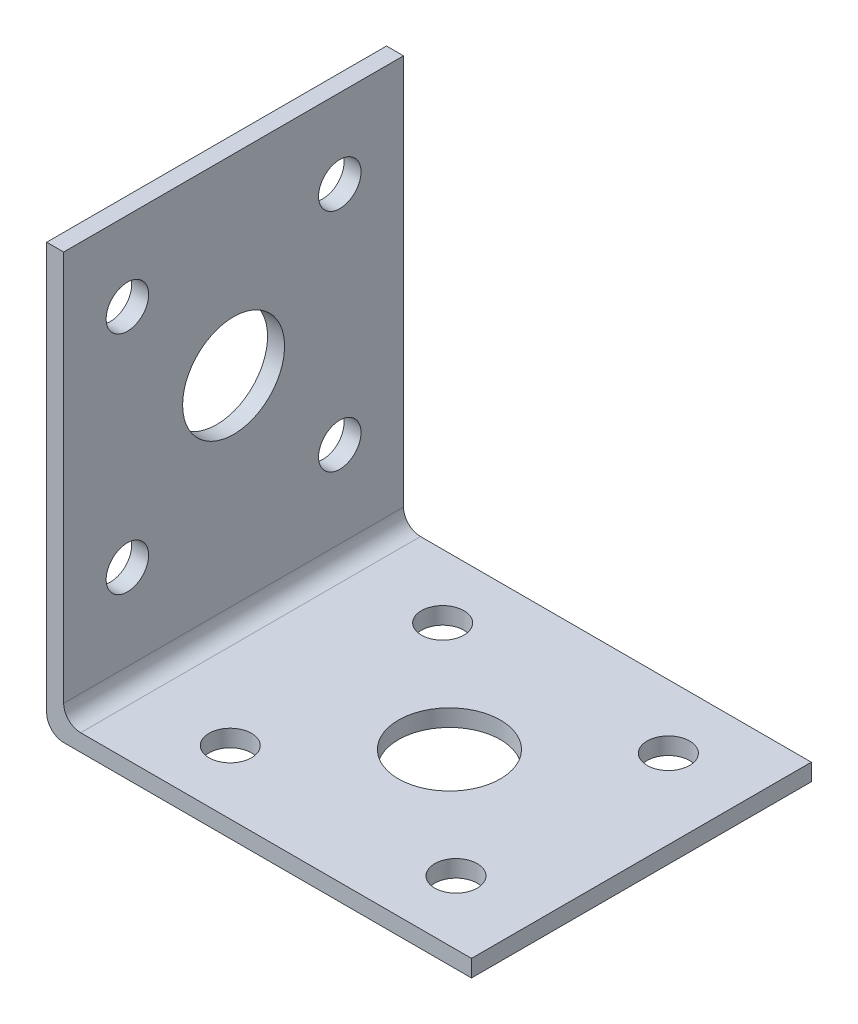
ISO-10303-21;
HEADER;
FILE_DESCRIPTION(('STEP AP214'),'2;1');
FILE_NAME('part.step','',(''),(''),'','','');
FILE_SCHEMA(('AUTOMOTIVE_DESIGN { 1 0 10303 214 1 1 1 1 }'));
ENDSEC;
DATA;
#1=APPLICATION_CONTEXT('core data for automotive mechanical design processes');
#2=APPLICATION_PROTOCOL_DEFINITION('international standard','automotive_design',2000,#1);
#3=PRODUCT_CONTEXT('',#1,'mechanical');
#4=PRODUCT('Part','Part','',(#3));
#5=PRODUCT_RELATED_PRODUCT_CATEGORY('part','',(#4));
#6=PRODUCT_DEFINITION_FORMATION('','',#4);
#7=PRODUCT_DEFINITION_CONTEXT('part definition',#1,'design');
#8=PRODUCT_DEFINITION('design','',#6,#7);
#9=PRODUCT_DEFINITION_SHAPE('','',#8);
#10=(LENGTH_UNIT() NAMED_UNIT(*) SI_UNIT(.MILLI.,.METRE.));
#11=(NAMED_UNIT(*) PLANE_ANGLE_UNIT() SI_UNIT($,.RADIAN.));
#12=(NAMED_UNIT(*) SI_UNIT($,.STERADIAN.) SOLID_ANGLE_UNIT());
#13=UNCERTAINTY_MEASURE_WITH_UNIT(LENGTH_MEASURE(1.E-05),#10,'distance_accuracy_value','');
#14=(GEOMETRIC_REPRESENTATION_CONTEXT(3) GLOBAL_UNCERTAINTY_ASSIGNED_CONTEXT((#13)) GLOBAL_UNIT_ASSIGNED_CONTEXT((#10,
#11,#12)) REPRESENTATION_CONTEXT('',''));
#15=CARTESIAN_POINT('',(0.,0.,0.));
#16=DIRECTION('',(0.,0.,1.));
#17=DIRECTION('',(1.,0.,0.));
#18=AXIS2_PLACEMENT_3D('',#15,#16,#17);
#19=CARTESIAN_POINT('',(0.,50.,20.));
#20=DIRECTION('',(0.,-1.,0.));
#21=DIRECTION('',(0.,0.,-1.));
#22=AXIS2_PLACEMENT_3D('',#19,#20,#21);
#23=PLANE('',#22);
#24=DIRECTION('',(-1.,0.,0.));
#25=VECTOR('',#24,1.);
#26=CARTESIAN_POINT('',(0.,50.,-20.));
#27=LINE('',#26,#25);
#28=CARTESIAN_POINT('',(2.,50.,-20.));
#29=VERTEX_POINT('',#28);
#30=CARTESIAN_POINT('',(0.,50.,-20.));
#31=VERTEX_POINT('',#30);
#32=EDGE_CURVE('E133',#29,#31,#27,.T.);
#33=ORIENTED_EDGE('',*,*,#32,.T.);
#34=DIRECTION('',(0.,0.,-1.));
#35=VECTOR('',#34,1.);
#36=CARTESIAN_POINT('',(0.,50.,20.));
#37=LINE('',#36,#35);
#38=CARTESIAN_POINT('',(0.,50.,20.));
#39=VERTEX_POINT('',#38);
#40=EDGE_CURVE('E11',#39,#31,#37,.T.);
#41=ORIENTED_EDGE('',*,*,#40,.F.);
#42=DIRECTION('',(-1.,0.,0.));
#43=VECTOR('',#42,1.);
#44=CARTESIAN_POINT('',(0.,50.,20.));
#45=LINE('',#44,#43);
#46=CARTESIAN_POINT('',(2.,50.,20.));
#47=VERTEX_POINT('',#46);
#48=EDGE_CURVE('E148',#47,#39,#45,.T.);
#49=ORIENTED_EDGE('',*,*,#48,.F.);
#50=DIRECTION('',(0.,0.,-1.));
#51=VECTOR('',#50,1.);
#52=CARTESIAN_POINT('',(2.,50.,20.));
#53=LINE('',#52,#51);
#54=EDGE_CURVE('E129',#47,#29,#53,.T.);
#55=ORIENTED_EDGE('',*,*,#54,.T.);
#56=EDGE_LOOP('',(#33,#41,#49,#55));
#57=FACE_BOUND('',#56,.T.);
#58=ADVANCED_FACE('F37',(#57),#23,.F.);
#59=CARTESIAN_POINT('',(0.,2.00000000000001,20.));
#60=DIRECTION('',(1.,0.,0.));
#61=DIRECTION('',(0.,0.,-1.));
#62=AXIS2_PLACEMENT_3D('',#59,#60,#61);
#63=PLANE('',#62);
#64=CARTESIAN_POINT('',(0.,14.1076439807601,-12.5));
#65=DIRECTION('',(1.,0.,0.));
#66=DIRECTION('',(0.,0.,-1.));
#67=AXIS2_PLACEMENT_3D('',#64,#65,#66);
#68=CIRCLE('',#67,2.5);
#69=CARTESIAN_POINT('',(0.,14.1076439807601,-15.));
#70=VERTEX_POINT('',#69);
#71=EDGE_CURVE('E203',#70,#70,#68,.F.);
#72=ORIENTED_EDGE('',*,*,#71,.F.);
#73=EDGE_LOOP('',(#72));
#74=FACE_BOUND('',#73,.T.);
#75=CARTESIAN_POINT('',(0.,14.1076439807601,12.5));
#76=DIRECTION('',(1.,0.,0.));
#77=DIRECTION('',(0.,0.,-1.));
#78=AXIS2_PLACEMENT_3D('',#75,#76,#77);
#79=CIRCLE('',#78,2.5);
#80=CARTESIAN_POINT('',(0.,14.1076439807601,10.));
#81=VERTEX_POINT('',#80);
#82=EDGE_CURVE('E213',#81,#81,#79,.F.);
#83=ORIENTED_EDGE('',*,*,#82,.F.);
#84=EDGE_LOOP('',(#83));
#85=FACE_BOUND('',#84,.T.);
#86=CARTESIAN_POINT('',(0.,40.6750781181339,12.5));
#87=DIRECTION('',(1.,0.,0.));
#88=DIRECTION('',(0.,0.,-1.));
#89=AXIS2_PLACEMENT_3D('',#86,#87,#88);
#90=CIRCLE('',#89,2.5);
#91=CARTESIAN_POINT('',(0.,40.6750781181339,10.));
#92=VERTEX_POINT('',#91);
#93=EDGE_CURVE('E216',#92,#92,#90,.F.);
#94=ORIENTED_EDGE('',*,*,#93,.F.);
#95=EDGE_LOOP('',(#94));
#96=FACE_BOUND('',#95,.T.);
#97=CARTESIAN_POINT('',(0.,40.6750781181339,-12.5));
#98=DIRECTION('',(1.,0.,0.));
#99=DIRECTION('',(0.,0.,-1.));
#100=AXIS2_PLACEMENT_3D('',#97,#98,#99);
#101=CIRCLE('',#100,2.5);
#102=CARTESIAN_POINT('',(0.,40.6750781181339,-15.));
#103=VERTEX_POINT('',#102);
#104=EDGE_CURVE('E219',#103,#103,#101,.F.);
#105=ORIENTED_EDGE('',*,*,#104,.F.);
#106=EDGE_LOOP('',(#105));
#107=FACE_BOUND('',#106,.T.);
#108=CARTESIAN_POINT('',(0.,27.405417892906,0.));
#109=DIRECTION('',(1.,0.,0.));
#110=DIRECTION('',(0.,0.,-1.));
#111=AXIS2_PLACEMENT_3D('',#108,#109,#110);
#112=CIRCLE('',#111,5.99999999999999);
#113=CARTESIAN_POINT('',(0.,27.405417892906,-5.99999999999999));
#114=VERTEX_POINT('',#113);
#115=EDGE_CURVE('E222',#114,#114,#112,.F.);
#116=ORIENTED_EDGE('',*,*,#115,.F.);
#117=EDGE_LOOP('',(#116));
#118=FACE_BOUND('',#117,.T.);
#119=DIRECTION('',(0.,-1.,0.));
#120=VECTOR('',#119,1.);
#121=CARTESIAN_POINT('',(0.,2.00000000000001,-20.));
#122=LINE('',#121,#120);
#123=CARTESIAN_POINT('',(0.,2.00000000000001,-20.));
#124=VERTEX_POINT('',#123);
#125=EDGE_CURVE('E136',#31,#124,#122,.T.);
#126=ORIENTED_EDGE('',*,*,#125,.T.);
#127=DIRECTION('',(0.,0.,-1.));
#128=VECTOR('',#127,1.);
#129=CARTESIAN_POINT('',(0.,2.00000000000001,20.));
#130=LINE('',#129,#128);
#131=CARTESIAN_POINT('',(0.,2.00000000000001,20.));
#132=VERTEX_POINT('',#131);
#133=EDGE_CURVE('E45',#132,#124,#130,.T.);
#134=ORIENTED_EDGE('',*,*,#133,.F.);
#135=DIRECTION('',(0.,-1.,0.));
#136=VECTOR('',#135,1.);
#137=CARTESIAN_POINT('',(0.,2.00000000000001,20.));
#138=LINE('',#137,#136);
#139=EDGE_CURVE('E96',#39,#132,#138,.T.);
#140=ORIENTED_EDGE('',*,*,#139,.F.);
#141=ORIENTED_EDGE('',*,*,#40,.T.);
#142=EDGE_LOOP('',(#126,#134,#140,#141));
#143=FACE_BOUND('',#142,.T.);
#144=ADVANCED_FACE('F252',(#74,#85,#96,#107,#118,#143),#63,.F.);
#145=CARTESIAN_POINT('',(2.,2.,20.));
#146=DIRECTION('',(0.,0.,-1.));
#147=DIRECTION('',(-1.,0.,0.));
#148=AXIS2_PLACEMENT_3D('',#145,#146,#147);
#149=CYLINDRICAL_SURFACE('',#148,2.);
#150=CARTESIAN_POINT('',(2.,2.,-20.));
#151=DIRECTION('',(0.,0.,1.));
#152=DIRECTION('',(1.,0.,0.));
#153=AXIS2_PLACEMENT_3D('',#150,#151,#152);
#154=CIRCLE('',#153,2.);
#155=CARTESIAN_POINT('',(2.00000000000001,0.,-20.));
#156=VERTEX_POINT('',#155);
#157=EDGE_CURVE('E139',#124,#156,#154,.T.);
#158=ORIENTED_EDGE('',*,*,#157,.T.);
#159=DIRECTION('',(0.,0.,-1.));
#160=VECTOR('',#159,1.);
#161=CARTESIAN_POINT('',(2.00000000000001,0.,20.));
#162=LINE('',#161,#160);
#163=CARTESIAN_POINT('',(2.00000000000001,0.,20.));
#164=VERTEX_POINT('',#163);
#165=EDGE_CURVE('E155',#164,#156,#162,.T.);
#166=ORIENTED_EDGE('',*,*,#165,.F.);
#167=CARTESIAN_POINT('',(2.,2.,20.));
#168=DIRECTION('',(0.,0.,1.));
#169=DIRECTION('',(1.,0.,0.));
#170=AXIS2_PLACEMENT_3D('',#167,#168,#169);
#171=CIRCLE('',#170,2.);
#172=EDGE_CURVE('E163',#132,#164,#171,.T.);
#173=ORIENTED_EDGE('',*,*,#172,.F.);
#174=ORIENTED_EDGE('',*,*,#133,.T.);
#175=EDGE_LOOP('',(#158,#166,#173,#174));
#176=FACE_BOUND('',#175,.T.);
#177=ADVANCED_FACE('F161',(#176),#149,.T.);
#178=CARTESIAN_POINT('',(50.,0.,20.));
#179=DIRECTION('',(0.,1.,0.));
#180=DIRECTION('',(0.,0.,1.));
#181=AXIS2_PLACEMENT_3D('',#178,#179,#180);
#182=PLANE('',#181);
#183=CARTESIAN_POINT('',(14.1076439807601,0.,-12.5));
#184=DIRECTION('',(0.,1.,0.));
#185=DIRECTION('',(0.,0.,1.));
#186=AXIS2_PLACEMENT_3D('',#183,#184,#185);
#187=CIRCLE('',#186,2.5);
#188=CARTESIAN_POINT('',(14.1076439807601,0.,-10.));
#189=VERTEX_POINT('',#188);
#190=EDGE_CURVE('E137',#189,#189,#187,.T.);
#191=ORIENTED_EDGE('',*,*,#190,.T.);
#192=EDGE_LOOP('',(#191));
#193=FACE_BOUND('',#192,.T.);
#194=CARTESIAN_POINT('',(14.1076439807601,0.,12.5));
#195=DIRECTION('',(0.,1.,0.));
#196=DIRECTION('',(0.,0.,1.));
#197=AXIS2_PLACEMENT_3D('',#194,#195,#196);
#198=CIRCLE('',#197,2.5);
#199=CARTESIAN_POINT('',(14.1076439807601,0.,15.));
#200=VERTEX_POINT('',#199);
#201=EDGE_CURVE('E183',#200,#200,#198,.T.);
#202=ORIENTED_EDGE('',*,*,#201,.T.);
#203=EDGE_LOOP('',(#202));
#204=FACE_BOUND('',#203,.T.);
#205=CARTESIAN_POINT('',(40.6750781181339,0.,12.5));
#206=DIRECTION('',(0.,1.,0.));
#207=DIRECTION('',(0.,0.,1.));
#208=AXIS2_PLACEMENT_3D('',#205,#206,#207);
#209=CIRCLE('',#208,2.5);
#210=CARTESIAN_POINT('',(40.6750781181339,0.,15.));
#211=VERTEX_POINT('',#210);
#212=EDGE_CURVE('E186',#211,#211,#209,.T.);
#213=ORIENTED_EDGE('',*,*,#212,.T.);
#214=EDGE_LOOP('',(#213));
#215=FACE_BOUND('',#214,.T.);
#216=CARTESIAN_POINT('',(40.6750781181339,0.,-12.5));
#217=DIRECTION('',(0.,1.,0.));
#218=DIRECTION('',(0.,0.,1.));
#219=AXIS2_PLACEMENT_3D('',#216,#217,#218);
#220=CIRCLE('',#219,2.5);
#221=CARTESIAN_POINT('',(40.6750781181339,0.,-10.));
#222=VERTEX_POINT('',#221);
#223=EDGE_CURVE('E189',#222,#222,#220,.T.);
#224=ORIENTED_EDGE('',*,*,#223,.T.);
#225=EDGE_LOOP('',(#224));
#226=FACE_BOUND('',#225,.T.);
#227=CARTESIAN_POINT('',(27.405417892906,0.,0.));
#228=DIRECTION('',(0.,1.,0.));
#229=DIRECTION('',(0.,0.,1.));
#230=AXIS2_PLACEMENT_3D('',#227,#228,#229);
#231=CIRCLE('',#230,5.99999999999999);
#232=CARTESIAN_POINT('',(27.405417892906,0.,6.));
#233=VERTEX_POINT('',#232);
#234=EDGE_CURVE('E192',#233,#233,#231,.T.);
#235=ORIENTED_EDGE('',*,*,#234,.T.);
#236=EDGE_LOOP('',(#235));
#237=FACE_BOUND('',#236,.T.);
#238=DIRECTION('',(1.,0.,0.));
#239=VECTOR('',#238,1.);
#240=CARTESIAN_POINT('',(50.,0.,-20.));
#241=LINE('',#240,#239);
#242=CARTESIAN_POINT('',(50.,0.,-20.));
#243=VERTEX_POINT('',#242);
#244=EDGE_CURVE('E141',#156,#243,#241,.T.);
#245=ORIENTED_EDGE('',*,*,#244,.T.);
#246=DIRECTION('',(0.,0.,-1.));
#247=VECTOR('',#246,1.);
#248=CARTESIAN_POINT('',(50.,0.,20.));
#249=LINE('',#248,#247);
#250=CARTESIAN_POINT('',(50.,0.,20.));
#251=VERTEX_POINT('',#250);
#252=EDGE_CURVE('E152',#251,#243,#249,.T.);
#253=ORIENTED_EDGE('',*,*,#252,.F.);
#254=DIRECTION('',(1.,0.,0.));
#255=VECTOR('',#254,1.);
#256=CARTESIAN_POINT('',(50.,0.,20.));
#257=LINE('',#256,#255);
#258=EDGE_CURVE('E175',#164,#251,#257,.T.);
#259=ORIENTED_EDGE('',*,*,#258,.F.);
#260=ORIENTED_EDGE('',*,*,#165,.T.);
#261=EDGE_LOOP('',(#245,#253,#259,#260));
#262=FACE_BOUND('',#261,.T.);
#263=ADVANCED_FACE('F171',(#193,#204,#215,#226,#237,#262),#182,.F.);
#264=CARTESIAN_POINT('',(50.,2.,20.));
#265=DIRECTION('',(-1.,0.,0.));
#266=DIRECTION('',(0.,0.,1.));
#267=AXIS2_PLACEMENT_3D('',#264,#265,#266);
#268=PLANE('',#267);
#269=DIRECTION('',(0.,1.,0.));
#270=VECTOR('',#269,1.);
#271=CARTESIAN_POINT('',(50.,2.,-20.));
#272=LINE('',#271,#270);
#273=CARTESIAN_POINT('',(50.,2.,-20.));
#274=VERTEX_POINT('',#273);
#275=EDGE_CURVE('E143',#243,#274,#272,.T.);
#276=ORIENTED_EDGE('',*,*,#275,.T.);
#277=DIRECTION('',(0.,0.,-1.));
#278=VECTOR('',#277,1.);
#279=CARTESIAN_POINT('',(50.,2.,20.));
#280=LINE('',#279,#278);
#281=CARTESIAN_POINT('',(50.,2.,20.));
#282=VERTEX_POINT('',#281);
#283=EDGE_CURVE('E124',#282,#274,#280,.T.);
#284=ORIENTED_EDGE('',*,*,#283,.F.);
#285=DIRECTION('',(0.,1.,0.));
#286=VECTOR('',#285,1.);
#287=CARTESIAN_POINT('',(50.,2.,20.));
#288=LINE('',#287,#286);
#289=EDGE_CURVE('E115',#251,#282,#288,.T.);
#290=ORIENTED_EDGE('',*,*,#289,.F.);
#291=ORIENTED_EDGE('',*,*,#252,.T.);
#292=EDGE_LOOP('',(#276,#284,#290,#291));
#293=FACE_BOUND('',#292,.T.);
#294=ADVANCED_FACE('F174',(#293),#268,.F.);
#295=CARTESIAN_POINT('',(4.00000000000002,2.,20.));
#296=DIRECTION('',(0.,-1.,0.));
#297=DIRECTION('',(0.,0.,-1.));
#298=AXIS2_PLACEMENT_3D('',#295,#296,#297);
#299=PLANE('',#298);
#300=CARTESIAN_POINT('',(14.1076439807601,2.,-12.5));
#301=DIRECTION('',(0.,1.,0.));
#302=DIRECTION('',(0.,0.,1.));
#303=AXIS2_PLACEMENT_3D('',#300,#301,#302);
#304=CIRCLE('',#303,2.5);
#305=CARTESIAN_POINT('',(14.1076439807601,2.,-10.));
#306=VERTEX_POINT('',#305);
#307=EDGE_CURVE('E199',#306,#306,#304,.T.);
#308=ORIENTED_EDGE('',*,*,#307,.F.);
#309=EDGE_LOOP('',(#308));
#310=FACE_BOUND('',#309,.T.);
#311=CARTESIAN_POINT('',(14.1076439807601,2.,12.5));
#312=DIRECTION('',(0.,1.,0.));
#313=DIRECTION('',(0.,0.,1.));
#314=AXIS2_PLACEMENT_3D('',#311,#312,#313);
#315=CIRCLE('',#314,2.5);
#316=CARTESIAN_POINT('',(14.1076439807601,2.,15.));
#317=VERTEX_POINT('',#316);
#318=EDGE_CURVE('E202',#317,#317,#315,.T.);
#319=ORIENTED_EDGE('',*,*,#318,.F.);
#320=EDGE_LOOP('',(#319));
#321=FACE_BOUND('',#320,.T.);
#322=CARTESIAN_POINT('',(40.6750781181339,2.,12.5));
#323=DIRECTION('',(0.,1.,0.));
#324=DIRECTION('',(0.,0.,1.));
#325=AXIS2_PLACEMENT_3D('',#322,#323,#324);
#326=CIRCLE('',#325,2.5);
#327=CARTESIAN_POINT('',(40.6750781181339,2.,15.));
#328=VERTEX_POINT('',#327);
#329=EDGE_CURVE('E206',#328,#328,#326,.T.);
#330=ORIENTED_EDGE('',*,*,#329,.F.);
#331=EDGE_LOOP('',(#330));
#332=FACE_BOUND('',#331,.T.);
#333=CARTESIAN_POINT('',(40.6750781181339,2.,-12.5));
#334=DIRECTION('',(0.,1.,0.));
#335=DIRECTION('',(0.,0.,1.));
#336=AXIS2_PLACEMENT_3D('',#333,#334,#335);
#337=CIRCLE('',#336,2.5);
#338=CARTESIAN_POINT('',(40.6750781181339,2.,-10.));
#339=VERTEX_POINT('',#338);
#340=EDGE_CURVE('E198',#339,#339,#337,.T.);
#341=ORIENTED_EDGE('',*,*,#340,.F.);
#342=EDGE_LOOP('',(#341));
#343=FACE_BOUND('',#342,.T.);
#344=CARTESIAN_POINT('',(27.405417892906,2.,0.));
#345=DIRECTION('',(0.,1.,0.));
#346=DIRECTION('',(0.,0.,1.));
#347=AXIS2_PLACEMENT_3D('',#344,#345,#346);
#348=CIRCLE('',#347,5.99999999999999);
#349=CARTESIAN_POINT('',(27.405417892906,2.,6.));
#350=VERTEX_POINT('',#349);
#351=EDGE_CURVE('E195',#350,#350,#348,.T.);
#352=ORIENTED_EDGE('',*,*,#351,.F.);
#353=EDGE_LOOP('',(#352));
#354=FACE_BOUND('',#353,.T.);
#355=DIRECTION('',(-1.,0.,0.));
#356=VECTOR('',#355,1.);
#357=CARTESIAN_POINT('',(4.00000000000002,2.,-20.));
#358=LINE('',#357,#356);
#359=CARTESIAN_POINT('',(4.00000000000002,2.,-20.));
#360=VERTEX_POINT('',#359);
#361=EDGE_CURVE('E123',#274,#360,#358,.T.);
#362=ORIENTED_EDGE('',*,*,#361,.T.);
#363=DIRECTION('',(0.,0.,-1.));
#364=VECTOR('',#363,1.);
#365=CARTESIAN_POINT('',(4.00000000000002,2.,20.));
#366=LINE('',#365,#364);
#367=CARTESIAN_POINT('',(4.00000000000002,2.,20.));
#368=VERTEX_POINT('',#367);
#369=EDGE_CURVE('E120',#368,#360,#366,.T.);
#370=ORIENTED_EDGE('',*,*,#369,.F.);
#371=DIRECTION('',(-1.,0.,0.));
#372=VECTOR('',#371,1.);
#373=CARTESIAN_POINT('',(4.00000000000002,2.,20.));
#374=LINE('',#373,#372);
#375=EDGE_CURVE('E109',#282,#368,#374,.T.);
#376=ORIENTED_EDGE('',*,*,#375,.F.);
#377=ORIENTED_EDGE('',*,*,#283,.T.);
#378=EDGE_LOOP('',(#362,#370,#376,#377));
#379=FACE_BOUND('',#378,.T.);
#380=ADVANCED_FACE('F121',(#310,#321,#332,#343,#354,#379),#299,.F.);
#381=CARTESIAN_POINT('',(4.00000000000001,4.,20.));
#382=DIRECTION('',(0.,0.,-1.));
#383=DIRECTION('',(-1.,0.,0.));
#384=AXIS2_PLACEMENT_3D('',#381,#382,#383);
#385=CYLINDRICAL_SURFACE('',#384,2.);
#386=CARTESIAN_POINT('',(4.00000000000001,4.,-20.));
#387=DIRECTION('',(0.,0.,-1.));
#388=DIRECTION('',(1.,0.,0.));
#389=AXIS2_PLACEMENT_3D('',#386,#387,#388);
#390=CIRCLE('',#389,2.);
#391=CARTESIAN_POINT('',(2.00000000000001,4.00000000000001,-20.));
#392=VERTEX_POINT('',#391);
#393=EDGE_CURVE('E82',#360,#392,#390,.T.);
#394=ORIENTED_EDGE('',*,*,#393,.T.);
#395=DIRECTION('',(0.,0.,-1.));
#396=VECTOR('',#395,1.);
#397=CARTESIAN_POINT('',(2.00000000000001,4.00000000000001,20.));
#398=LINE('',#397,#396);
#399=CARTESIAN_POINT('',(2.00000000000001,4.00000000000001,20.));
#400=VERTEX_POINT('',#399);
#401=EDGE_CURVE('E125',#400,#392,#398,.T.);
#402=ORIENTED_EDGE('',*,*,#401,.F.);
#403=CARTESIAN_POINT('',(4.00000000000001,4.,20.));
#404=DIRECTION('',(0.,0.,-1.));
#405=DIRECTION('',(1.,0.,0.));
#406=AXIS2_PLACEMENT_3D('',#403,#404,#405);
#407=CIRCLE('',#406,2.);
#408=EDGE_CURVE('E113',#368,#400,#407,.T.);
#409=ORIENTED_EDGE('',*,*,#408,.F.);
#410=ORIENTED_EDGE('',*,*,#369,.T.);
#411=EDGE_LOOP('',(#394,#402,#409,#410));
#412=FACE_BOUND('',#411,.T.);
#413=ADVANCED_FACE('F127',(#412),#385,.F.);
#414=CARTESIAN_POINT('',(2.,50.,20.));
#415=DIRECTION('',(-1.,0.,0.));
#416=DIRECTION('',(0.,-1.,0.));
#417=AXIS2_PLACEMENT_3D('',#414,#415,#416);
#418=PLANE('',#417);
#419=CARTESIAN_POINT('',(1.99999999999995,14.1076439807601,-12.5));
#420=DIRECTION('',(-1.,0.,0.));
#421=DIRECTION('',(0.,0.,1.));
#422=AXIS2_PLACEMENT_3D('',#419,#420,#421);
#423=CIRCLE('',#422,2.5);
#424=CARTESIAN_POINT('',(1.99999999999995,14.1076439807601,-10.));
#425=VERTEX_POINT('',#424);
#426=EDGE_CURVE('E229',#425,#425,#423,.T.);
#427=ORIENTED_EDGE('',*,*,#426,.T.);
#428=EDGE_LOOP('',(#427));
#429=FACE_BOUND('',#428,.T.);
#430=CARTESIAN_POINT('',(1.99999999999995,14.1076439807601,12.5));
#431=DIRECTION('',(-1.,0.,0.));
#432=DIRECTION('',(0.,0.,1.));
#433=AXIS2_PLACEMENT_3D('',#430,#431,#432);
#434=CIRCLE('',#433,2.5);
#435=CARTESIAN_POINT('',(1.99999999999995,14.1076439807601,15.));
#436=VERTEX_POINT('',#435);
#437=EDGE_CURVE('E232',#436,#436,#434,.T.);
#438=ORIENTED_EDGE('',*,*,#437,.T.);
#439=EDGE_LOOP('',(#438));
#440=FACE_BOUND('',#439,.T.);
#441=CARTESIAN_POINT('',(1.99999999999986,40.6750781181339,12.5));
#442=DIRECTION('',(-1.,0.,0.));
#443=DIRECTION('',(0.,0.,1.));
#444=AXIS2_PLACEMENT_3D('',#441,#442,#443);
#445=CIRCLE('',#444,2.5);
#446=CARTESIAN_POINT('',(1.99999999999986,40.6750781181339,15.));
#447=VERTEX_POINT('',#446);
#448=EDGE_CURVE('E235',#447,#447,#445,.T.);
#449=ORIENTED_EDGE('',*,*,#448,.T.);
#450=EDGE_LOOP('',(#449));
#451=FACE_BOUND('',#450,.T.);
#452=CARTESIAN_POINT('',(1.99999999999986,40.6750781181339,-12.5));
#453=DIRECTION('',(-1.,0.,0.));
#454=DIRECTION('',(0.,0.,1.));
#455=AXIS2_PLACEMENT_3D('',#452,#453,#454);
#456=CIRCLE('',#455,2.5);
#457=CARTESIAN_POINT('',(1.99999999999986,40.6750781181339,-10.));
#458=VERTEX_POINT('',#457);
#459=EDGE_CURVE('E228',#458,#458,#456,.T.);
#460=ORIENTED_EDGE('',*,*,#459,.T.);
#461=EDGE_LOOP('',(#460));
#462=FACE_BOUND('',#461,.T.);
#463=CARTESIAN_POINT('',(1.9999999999999,27.405417892906,0.));
#464=DIRECTION('',(-1.,0.,0.));
#465=DIRECTION('',(0.,0.,1.));
#466=AXIS2_PLACEMENT_3D('',#463,#464,#465);
#467=CIRCLE('',#466,5.99999999999999);
#468=CARTESIAN_POINT('',(1.9999999999999,27.405417892906,6.));
#469=VERTEX_POINT('',#468);
#470=EDGE_CURVE('E225',#469,#469,#467,.T.);
#471=ORIENTED_EDGE('',*,*,#470,.T.);
#472=EDGE_LOOP('',(#471));
#473=FACE_BOUND('',#472,.T.);
#474=DIRECTION('',(0.,1.,0.));
#475=VECTOR('',#474,1.);
#476=CARTESIAN_POINT('',(2.,50.,-20.));
#477=LINE('',#476,#475);
#478=EDGE_CURVE('E88',#392,#29,#477,.T.);
#479=ORIENTED_EDGE('',*,*,#478,.T.);
#480=ORIENTED_EDGE('',*,*,#54,.F.);
#481=DIRECTION('',(0.,1.,0.));
#482=VECTOR('',#481,1.);
#483=CARTESIAN_POINT('',(2.,50.,20.));
#484=LINE('',#483,#482);
#485=EDGE_CURVE('E53',#400,#47,#484,.T.);
#486=ORIENTED_EDGE('',*,*,#485,.F.);
#487=ORIENTED_EDGE('',*,*,#401,.T.);
#488=EDGE_LOOP('',(#479,#480,#486,#487));
#489=FACE_BOUND('',#488,.T.);
#490=ADVANCED_FACE('F241',(#429,#440,#451,#462,#473,#489),#418,.F.);
#491=CARTESIAN_POINT('',(4.00000000000001,4.,20.));
#492=DIRECTION('',(0.,0.,1.));
#493=DIRECTION('',(1.,0.,0.));
#494=AXIS2_PLACEMENT_3D('',#491,#492,#493);
#495=PLANE('',#494);
#496=ORIENTED_EDGE('',*,*,#48,.T.);
#497=ORIENTED_EDGE('',*,*,#139,.T.);
#498=ORIENTED_EDGE('',*,*,#172,.T.);
#499=ORIENTED_EDGE('',*,*,#258,.T.);
#500=ORIENTED_EDGE('',*,*,#289,.T.);
#501=ORIENTED_EDGE('',*,*,#375,.T.);
#502=ORIENTED_EDGE('',*,*,#408,.T.);
#503=ORIENTED_EDGE('',*,*,#485,.T.);
#504=EDGE_LOOP('',(#496,#497,#498,#499,#500,#501,#502,#503));
#505=FACE_BOUND('',#504,.T.);
#506=ADVANCED_FACE('F111',(#505),#495,.T.);
#507=CARTESIAN_POINT('',(4.00000000000001,4.,-20.));
#508=DIRECTION('',(0.,0.,1.));
#509=DIRECTION('',(1.,0.,0.));
#510=AXIS2_PLACEMENT_3D('',#507,#508,#509);
#511=PLANE('',#510);
#512=ORIENTED_EDGE('',*,*,#32,.F.);
#513=ORIENTED_EDGE('',*,*,#478,.F.);
#514=ORIENTED_EDGE('',*,*,#393,.F.);
#515=ORIENTED_EDGE('',*,*,#361,.F.);
#516=ORIENTED_EDGE('',*,*,#275,.F.);
#517=ORIENTED_EDGE('',*,*,#244,.F.);
#518=ORIENTED_EDGE('',*,*,#157,.F.);
#519=ORIENTED_EDGE('',*,*,#125,.F.);
#520=EDGE_LOOP('',(#512,#513,#514,#515,#516,#517,#518,#519));
#521=FACE_BOUND('',#520,.T.);
#522=ADVANCED_FACE('F167',(#521),#511,.F.);
#523=CARTESIAN_POINT('',(27.405417892906,-38.,0.));
#524=DIRECTION('',(0.,1.,0.));
#525=DIRECTION('',(0.,0.,1.));
#526=AXIS2_PLACEMENT_3D('',#523,#524,#525);
#527=CYLINDRICAL_SURFACE('',#526,5.99999999999999);
#528=ORIENTED_EDGE('',*,*,#351,.T.);
#529=EDGE_LOOP('',(#528));
#530=FACE_BOUND('',#529,.T.);
#531=ORIENTED_EDGE('',*,*,#234,.F.);
#532=EDGE_LOOP('',(#531));
#533=FACE_BOUND('',#532,.T.);
#534=ADVANCED_FACE('F327',(#530,#533),#527,.F.);
#535=CARTESIAN_POINT('',(40.6750781181339,-38.,-12.5));
#536=DIRECTION('',(0.,1.,0.));
#537=DIRECTION('',(0.,0.,1.));
#538=AXIS2_PLACEMENT_3D('',#535,#536,#537);
#539=CYLINDRICAL_SURFACE('',#538,2.5);
#540=ORIENTED_EDGE('',*,*,#340,.T.);
#541=EDGE_LOOP('',(#540));
#542=FACE_BOUND('',#541,.T.);
#543=ORIENTED_EDGE('',*,*,#223,.F.);
#544=EDGE_LOOP('',(#543));
#545=FACE_BOUND('',#544,.T.);
#546=ADVANCED_FACE('F336',(#542,#545),#539,.F.);
#547=CARTESIAN_POINT('',(40.6750781181339,-38.,12.5));
#548=DIRECTION('',(0.,1.,0.));
#549=DIRECTION('',(0.,0.,1.));
#550=AXIS2_PLACEMENT_3D('',#547,#548,#549);
#551=CYLINDRICAL_SURFACE('',#550,2.5);
#552=ORIENTED_EDGE('',*,*,#329,.T.);
#553=EDGE_LOOP('',(#552));
#554=FACE_BOUND('',#553,.T.);
#555=ORIENTED_EDGE('',*,*,#212,.F.);
#556=EDGE_LOOP('',(#555));
#557=FACE_BOUND('',#556,.T.);
#558=ADVANCED_FACE('F343',(#554,#557),#551,.F.);
#559=CARTESIAN_POINT('',(14.1076439807601,-38.,12.5));
#560=DIRECTION('',(0.,1.,0.));
#561=DIRECTION('',(0.,0.,1.));
#562=AXIS2_PLACEMENT_3D('',#559,#560,#561);
#563=CYLINDRICAL_SURFACE('',#562,2.5);
#564=ORIENTED_EDGE('',*,*,#318,.T.);
#565=EDGE_LOOP('',(#564));
#566=FACE_BOUND('',#565,.T.);
#567=ORIENTED_EDGE('',*,*,#201,.F.);
#568=EDGE_LOOP('',(#567));
#569=FACE_BOUND('',#568,.T.);
#570=ADVANCED_FACE('F351',(#566,#569),#563,.F.);
#571=CARTESIAN_POINT('',(14.1076439807601,-38.,-12.5));
#572=DIRECTION('',(0.,1.,0.));
#573=DIRECTION('',(0.,0.,1.));
#574=AXIS2_PLACEMENT_3D('',#571,#572,#573);
#575=CYLINDRICAL_SURFACE('',#574,2.5);
#576=ORIENTED_EDGE('',*,*,#307,.T.);
#577=EDGE_LOOP('',(#576));
#578=FACE_BOUND('',#577,.T.);
#579=ORIENTED_EDGE('',*,*,#190,.F.);
#580=EDGE_LOOP('',(#579));
#581=FACE_BOUND('',#580,.T.);
#582=ADVANCED_FACE('F359',(#578,#581),#575,.F.);
#583=CARTESIAN_POINT('',(-38.0000000000001,27.4054178929058,0.));
#584=DIRECTION('',(1.,0.,0.));
#585=DIRECTION('',(0.,1.,0.));
#586=AXIS2_PLACEMENT_3D('',#583,#584,#585);
#587=CYLINDRICAL_SURFACE('',#586,5.99999999999999);
#588=ORIENTED_EDGE('',*,*,#470,.F.);
#589=EDGE_LOOP('',(#588));
#590=FACE_BOUND('',#589,.T.);
#591=ORIENTED_EDGE('',*,*,#115,.T.);
#592=EDGE_LOOP('',(#591));
#593=FACE_BOUND('',#592,.T.);
#594=ADVANCED_FACE('F248',(#590,#593),#587,.F.);
#595=CARTESIAN_POINT('',(-38.0000000000001,40.6750781181338,-12.5));
#596=DIRECTION('',(1.,0.,0.));
#597=DIRECTION('',(0.,1.,0.));
#598=AXIS2_PLACEMENT_3D('',#595,#596,#597);
#599=CYLINDRICAL_SURFACE('',#598,2.5);
#600=ORIENTED_EDGE('',*,*,#459,.F.);
#601=EDGE_LOOP('',(#600));
#602=FACE_BOUND('',#601,.T.);
#603=ORIENTED_EDGE('',*,*,#104,.T.);
#604=EDGE_LOOP('',(#603));
#605=FACE_BOUND('',#604,.T.);
#606=ADVANCED_FACE('F244',(#602,#605),#599,.F.);
#607=CARTESIAN_POINT('',(-38.0000000000001,40.6750781181338,12.5));
#608=DIRECTION('',(1.,0.,0.));
#609=DIRECTION('',(0.,1.,0.));
#610=AXIS2_PLACEMENT_3D('',#607,#608,#609);
#611=CYLINDRICAL_SURFACE('',#610,2.5);
#612=ORIENTED_EDGE('',*,*,#448,.F.);
#613=EDGE_LOOP('',(#612));
#614=FACE_BOUND('',#613,.T.);
#615=ORIENTED_EDGE('',*,*,#93,.T.);
#616=EDGE_LOOP('',(#615));
#617=FACE_BOUND('',#616,.T.);
#618=ADVANCED_FACE('F247',(#614,#617),#611,.F.);
#619=CARTESIAN_POINT('',(-38.,14.10764398076,12.5));
#620=DIRECTION('',(1.,0.,0.));
#621=DIRECTION('',(0.,1.,0.));
#622=AXIS2_PLACEMENT_3D('',#619,#620,#621);
#623=CYLINDRICAL_SURFACE('',#622,2.5);
#624=ORIENTED_EDGE('',*,*,#437,.F.);
#625=EDGE_LOOP('',(#624));
#626=FACE_BOUND('',#625,.T.);
#627=ORIENTED_EDGE('',*,*,#82,.T.);
#628=EDGE_LOOP('',(#627));
#629=FACE_BOUND('',#628,.T.);
#630=ADVANCED_FACE('F384',(#626,#629),#623,.F.);
#631=CARTESIAN_POINT('',(-38.,14.10764398076,-12.5));
#632=DIRECTION('',(1.,0.,0.));
#633=DIRECTION('',(0.,1.,0.));
#634=AXIS2_PLACEMENT_3D('',#631,#632,#633);
#635=CYLINDRICAL_SURFACE('',#634,2.5);
#636=ORIENTED_EDGE('',*,*,#426,.F.);
#637=EDGE_LOOP('',(#636));
#638=FACE_BOUND('',#637,.T.);
#639=ORIENTED_EDGE('',*,*,#71,.T.);
#640=EDGE_LOOP('',(#639));
#641=FACE_BOUND('',#640,.T.);
#642=ADVANCED_FACE('F392',(#638,#641),#635,.F.);
#643=CLOSED_SHELL('',(#58,#144,#177,#263,#294,#380,#413,#490,#506,#522,#534,#546,#558,#570,#582,
#594,#606,#618,#630,#642));
#644=MANIFOLD_SOLID_BREP('B2',#643);
#645=ADVANCED_BREP_SHAPE_REPRESENTATION('',(#18,#644),#14);
#646=SHAPE_DEFINITION_REPRESENTATION(#9,#645);
ENDSEC;
END-ISO-10303-21;
